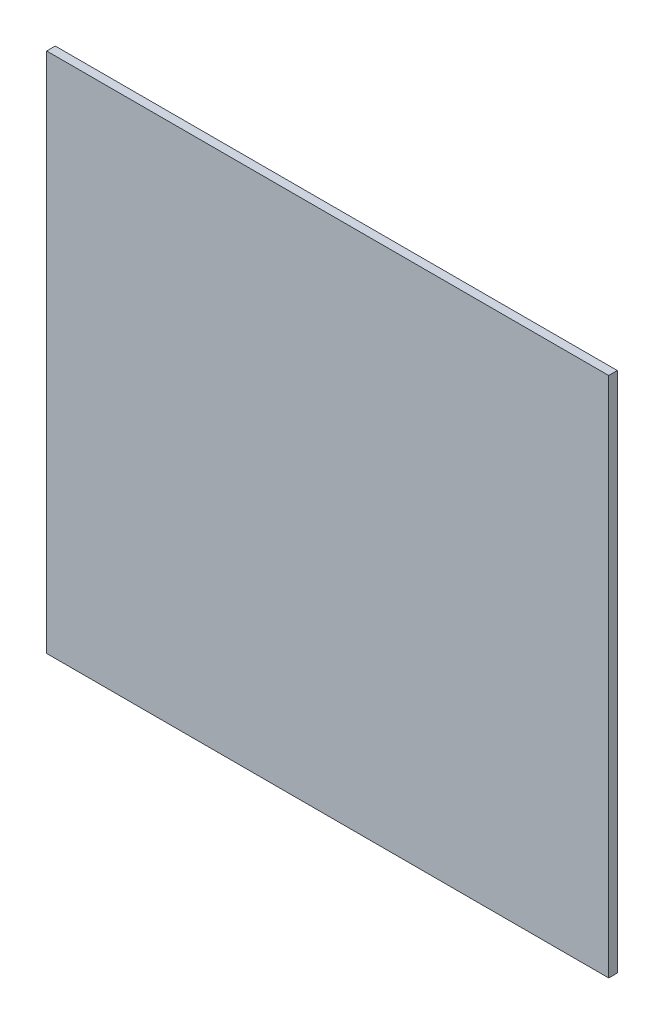
ISO-10303-21;
HEADER;
FILE_DESCRIPTION(('STEP AP214'),'2;1');
FILE_NAME('part.step','',(''),(''),'','','');
FILE_SCHEMA(('AUTOMOTIVE_DESIGN { 1 0 10303 214 1 1 1 1 }'));
ENDSEC;
DATA;
#1=APPLICATION_CONTEXT('core data for automotive mechanical design processes');
#2=APPLICATION_PROTOCOL_DEFINITION('international standard','automotive_design',2000,#1);
#3=PRODUCT_CONTEXT('',#1,'mechanical');
#4=PRODUCT('Part','Part','',(#3));
#5=PRODUCT_RELATED_PRODUCT_CATEGORY('part','',(#4));
#6=PRODUCT_DEFINITION_FORMATION('','',#4);
#7=PRODUCT_DEFINITION_CONTEXT('part definition',#1,'design');
#8=PRODUCT_DEFINITION('design','',#6,#7);
#9=PRODUCT_DEFINITION_SHAPE('','',#8);
#10=(LENGTH_UNIT() NAMED_UNIT(*) SI_UNIT(.MILLI.,.METRE.));
#11=(NAMED_UNIT(*) PLANE_ANGLE_UNIT() SI_UNIT($,.RADIAN.));
#12=(NAMED_UNIT(*) SI_UNIT($,.STERADIAN.) SOLID_ANGLE_UNIT());
#13=UNCERTAINTY_MEASURE_WITH_UNIT(LENGTH_MEASURE(1.E-05),#10,'distance_accuracy_value','');
#14=(GEOMETRIC_REPRESENTATION_CONTEXT(3) GLOBAL_UNCERTAINTY_ASSIGNED_CONTEXT((#13)) GLOBAL_UNIT_ASSIGNED_CONTEXT((#10,
#11,#12)) REPRESENTATION_CONTEXT('',''));
#15=CARTESIAN_POINT('',(0.,0.,0.));
#16=DIRECTION('',(0.,0.,1.));
#17=DIRECTION('',(1.,0.,0.));
#18=AXIS2_PLACEMENT_3D('',#15,#16,#17);
#19=CARTESIAN_POINT('',(1.47286895662552,127.,4.445));
#20=DIRECTION('',(0.,1.,0.));
#21=DIRECTION('',(0.,0.,1.));
#22=AXIS2_PLACEMENT_3D('',#19,#20,#21);
#23=PLANE('',#22);
#24=DIRECTION('',(1.,0.,0.));
#25=VECTOR('',#24,1.);
#26=CARTESIAN_POINT('',(1.47286895662552,127.,0.));
#27=LINE('',#26,#25);
#28=CARTESIAN_POINT('',(-143.737571287977,127.,0.));
#29=VERTEX_POINT('',#28);
#30=CARTESIAN_POINT('',(146.683309201228,127.,0.));
#31=VERTEX_POINT('',#30);
#32=EDGE_CURVE('E79',#29,#31,#27,.T.);
#33=ORIENTED_EDGE('',*,*,#32,.F.);
#34=DIRECTION('',(0.,0.,-1.));
#35=VECTOR('',#34,1.);
#36=CARTESIAN_POINT('',(-143.737571287977,127.,4.445));
#37=LINE('',#36,#35);
#38=CARTESIAN_POINT('',(-143.737571287977,127.,4.445));
#39=VERTEX_POINT('',#38);
#40=EDGE_CURVE('E10',#39,#29,#37,.T.);
#41=ORIENTED_EDGE('',*,*,#40,.F.);
#42=DIRECTION('',(1.,0.,0.));
#43=VECTOR('',#42,1.);
#44=CARTESIAN_POINT('',(1.47286895662552,127.,4.445));
#45=LINE('',#44,#43);
#46=CARTESIAN_POINT('',(146.683309201228,127.,4.445));
#47=VERTEX_POINT('',#46);
#48=EDGE_CURVE('E64',#39,#47,#45,.T.);
#49=ORIENTED_EDGE('',*,*,#48,.T.);
#50=DIRECTION('',(0.,0.,-1.));
#51=VECTOR('',#50,1.);
#52=CARTESIAN_POINT('',(146.683309201228,127.,4.445));
#53=LINE('',#52,#51);
#54=EDGE_CURVE('E32',#47,#31,#53,.T.);
#55=ORIENTED_EDGE('',*,*,#54,.T.);
#56=EDGE_LOOP('',(#33,#41,#49,#55));
#57=FACE_BOUND('',#56,.T.);
#58=ADVANCED_FACE('F16',(#57),#23,.T.);
#59=CARTESIAN_POINT('',(-143.737571287977,-7.80447372828258,4.445));
#60=DIRECTION('',(1.,0.,0.));
#61=DIRECTION('',(0.,0.,-1.));
#62=AXIS2_PLACEMENT_3D('',#59,#60,#61);
#63=PLANE('',#62);
#64=DIRECTION('',(0.,-1.,0.));
#65=VECTOR('',#64,1.);
#66=CARTESIAN_POINT('',(-143.737571287977,-7.80447372828258,0.));
#67=LINE('',#66,#65);
#68=CARTESIAN_POINT('',(-143.737571287977,-142.608947456565,0.));
#69=VERTEX_POINT('',#68);
#70=EDGE_CURVE('E70',#29,#69,#67,.T.);
#71=ORIENTED_EDGE('',*,*,#70,.T.);
#72=DIRECTION('',(0.,0.,-1.));
#73=VECTOR('',#72,1.);
#74=CARTESIAN_POINT('',(-143.737571287977,-142.608947456565,4.445));
#75=LINE('',#74,#73);
#76=CARTESIAN_POINT('',(-143.737571287977,-142.608947456565,4.445));
#77=VERTEX_POINT('',#76);
#78=EDGE_CURVE('E24',#77,#69,#75,.T.);
#79=ORIENTED_EDGE('',*,*,#78,.F.);
#80=DIRECTION('',(0.,-1.,0.));
#81=VECTOR('',#80,1.);
#82=CARTESIAN_POINT('',(-143.737571287977,-7.80447372828258,4.445));
#83=LINE('',#82,#81);
#84=EDGE_CURVE('E58',#39,#77,#83,.T.);
#85=ORIENTED_EDGE('',*,*,#84,.F.);
#86=ORIENTED_EDGE('',*,*,#40,.T.);
#87=EDGE_LOOP('',(#71,#79,#85,#86));
#88=FACE_BOUND('',#87,.T.);
#89=ADVANCED_FACE('F68',(#88),#63,.F.);
#90=CARTESIAN_POINT('',(1.47286895662554,-142.608947456565,4.445));
#91=DIRECTION('',(0.,1.,0.));
#92=DIRECTION('',(0.,0.,1.));
#93=AXIS2_PLACEMENT_3D('',#90,#91,#92);
#94=PLANE('',#93);
#95=DIRECTION('',(1.,0.,0.));
#96=VECTOR('',#95,1.);
#97=CARTESIAN_POINT('',(1.47286895662554,-142.608947456565,0.));
#98=LINE('',#97,#96);
#99=CARTESIAN_POINT('',(146.683309201228,-142.608947456565,0.));
#100=VERTEX_POINT('',#99);
#101=EDGE_CURVE('E82',#69,#100,#98,.T.);
#102=ORIENTED_EDGE('',*,*,#101,.T.);
#103=DIRECTION('',(0.,0.,-1.));
#104=VECTOR('',#103,1.);
#105=CARTESIAN_POINT('',(146.683309201228,-142.608947456565,4.445));
#106=LINE('',#105,#104);
#107=CARTESIAN_POINT('',(146.683309201228,-142.608947456565,4.445));
#108=VERTEX_POINT('',#107);
#109=EDGE_CURVE('E46',#108,#100,#106,.T.);
#110=ORIENTED_EDGE('',*,*,#109,.F.);
#111=DIRECTION('',(1.,0.,0.));
#112=VECTOR('',#111,1.);
#113=CARTESIAN_POINT('',(1.47286895662554,-142.608947456565,4.445));
#114=LINE('',#113,#112);
#115=EDGE_CURVE('E63',#77,#108,#114,.T.);
#116=ORIENTED_EDGE('',*,*,#115,.F.);
#117=ORIENTED_EDGE('',*,*,#78,.T.);
#118=EDGE_LOOP('',(#102,#110,#116,#117));
#119=FACE_BOUND('',#118,.T.);
#120=ADVANCED_FACE('F73',(#119),#94,.F.);
#121=CARTESIAN_POINT('',(146.683309201228,-7.80447372828258,4.445));
#122=DIRECTION('',(1.,0.,0.));
#123=DIRECTION('',(0.,0.,-1.));
#124=AXIS2_PLACEMENT_3D('',#121,#122,#123);
#125=PLANE('',#124);
#126=DIRECTION('',(0.,-1.,0.));
#127=VECTOR('',#126,1.);
#128=CARTESIAN_POINT('',(146.683309201228,-7.80447372828258,0.));
#129=LINE('',#128,#127);
#130=EDGE_CURVE('E84',#31,#100,#129,.T.);
#131=ORIENTED_EDGE('',*,*,#130,.F.);
#132=ORIENTED_EDGE('',*,*,#54,.F.);
#133=DIRECTION('',(0.,-1.,0.));
#134=VECTOR('',#133,1.);
#135=CARTESIAN_POINT('',(146.683309201228,-7.80447372828258,4.445));
#136=LINE('',#135,#134);
#137=EDGE_CURVE('E74',#47,#108,#136,.T.);
#138=ORIENTED_EDGE('',*,*,#137,.T.);
#139=ORIENTED_EDGE('',*,*,#109,.T.);
#140=EDGE_LOOP('',(#131,#132,#138,#139));
#141=FACE_BOUND('',#140,.T.);
#142=ADVANCED_FACE('F89',(#141),#125,.T.);
#143=CARTESIAN_POINT('',(1.47286895662552,-7.80447372828258,4.445));
#144=DIRECTION('',(0.,0.,1.));
#145=DIRECTION('',(1.,0.,0.));
#146=AXIS2_PLACEMENT_3D('',#143,#144,#145);
#147=PLANE('',#146);
#148=ORIENTED_EDGE('',*,*,#48,.F.);
#149=ORIENTED_EDGE('',*,*,#84,.T.);
#150=ORIENTED_EDGE('',*,*,#115,.T.);
#151=ORIENTED_EDGE('',*,*,#137,.F.);
#152=EDGE_LOOP('',(#148,#149,#150,#151));
#153=FACE_BOUND('',#152,.T.);
#154=ADVANCED_FACE('F60',(#153),#147,.T.);
#155=CARTESIAN_POINT('',(1.47286895662552,-7.80447372828258,0.));
#156=DIRECTION('',(0.,0.,1.));
#157=DIRECTION('',(1.,0.,0.));
#158=AXIS2_PLACEMENT_3D('',#155,#156,#157);
#159=PLANE('',#158);
#160=ORIENTED_EDGE('',*,*,#32,.T.);
#161=ORIENTED_EDGE('',*,*,#130,.T.);
#162=ORIENTED_EDGE('',*,*,#101,.F.);
#163=ORIENTED_EDGE('',*,*,#70,.F.);
#164=EDGE_LOOP('',(#160,#161,#162,#163));
#165=FACE_BOUND('',#164,.T.);
#166=ADVANCED_FACE('F97',(#165),#159,.F.);
#167=CLOSED_SHELL('',(#58,#89,#120,#142,#154,#166));
#168=MANIFOLD_SOLID_BREP('B1',#167);
#169=ADVANCED_BREP_SHAPE_REPRESENTATION('',(#18,#168),#14);
#170=SHAPE_DEFINITION_REPRESENTATION(#9,#169);
ENDSEC;
END-ISO-10303-21;
